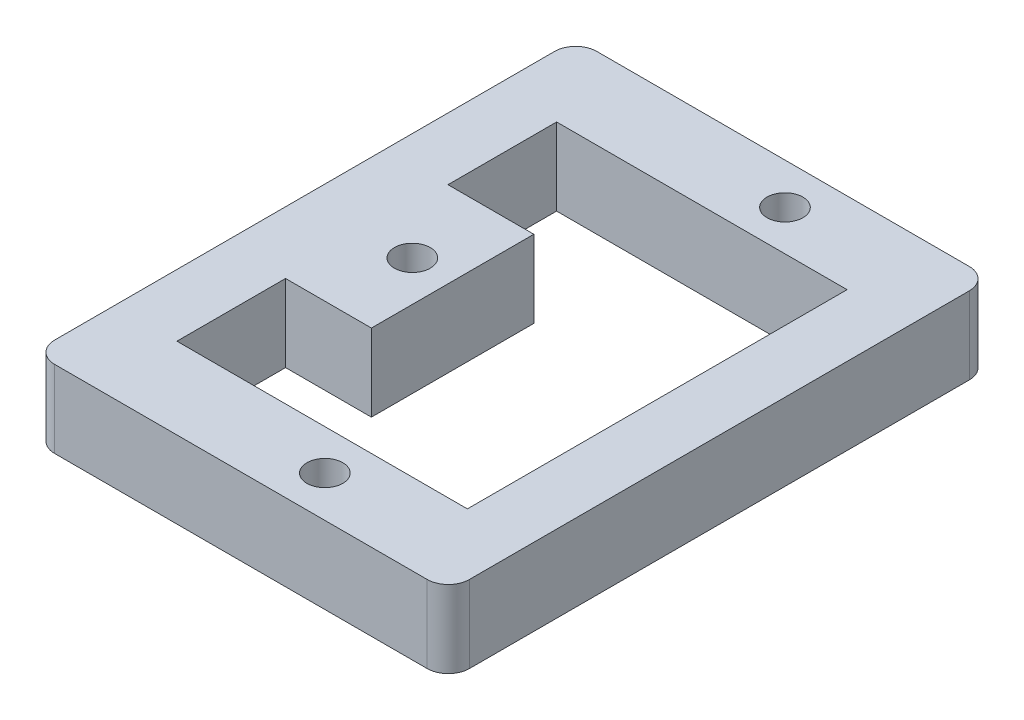
ISO-10303-21;
HEADER;
FILE_DESCRIPTION(('STEP AP214'),'2;1');
FILE_NAME('part.step','',(''),(''),'','','');
FILE_SCHEMA(('AUTOMOTIVE_DESIGN { 1 0 10303 214 1 1 1 1 }'));
ENDSEC;
DATA;
#1=APPLICATION_CONTEXT('core data for automotive mechanical design processes');
#2=APPLICATION_PROTOCOL_DEFINITION('international standard','automotive_design',2000,#1);
#3=PRODUCT_CONTEXT('',#1,'mechanical');
#4=PRODUCT('Part','Part','',(#3));
#5=PRODUCT_RELATED_PRODUCT_CATEGORY('part','',(#4));
#6=PRODUCT_DEFINITION_FORMATION('','',#4);
#7=PRODUCT_DEFINITION_CONTEXT('part definition',#1,'design');
#8=PRODUCT_DEFINITION('design','',#6,#7);
#9=PRODUCT_DEFINITION_SHAPE('','',#8);
#10=(LENGTH_UNIT() NAMED_UNIT(*) SI_UNIT(.MILLI.,.METRE.));
#11=(NAMED_UNIT(*) PLANE_ANGLE_UNIT() SI_UNIT($,.RADIAN.));
#12=(NAMED_UNIT(*) SI_UNIT($,.STERADIAN.) SOLID_ANGLE_UNIT());
#13=UNCERTAINTY_MEASURE_WITH_UNIT(LENGTH_MEASURE(1.E-05),#10,'distance_accuracy_value','');
#14=(GEOMETRIC_REPRESENTATION_CONTEXT(3) GLOBAL_UNCERTAINTY_ASSIGNED_CONTEXT((#13)) GLOBAL_UNIT_ASSIGNED_CONTEXT((#10,
#11,#12)) REPRESENTATION_CONTEXT('',''));
#15=CARTESIAN_POINT('',(0.,0.,0.));
#16=DIRECTION('',(0.,0.,1.));
#17=DIRECTION('',(1.,0.,0.));
#18=AXIS2_PLACEMENT_3D('',#15,#16,#17);
#19=CARTESIAN_POINT('',(-12.4841,4.6482,16.3195));
#20=DIRECTION('',(-1.,0.,0.));
#21=DIRECTION('',(0.,0.,1.));
#22=AXIS2_PLACEMENT_3D('',#19,#20,#21);
#23=PLANE('',#22);
#24=DIRECTION('',(0.,0.,-1.));
#25=VECTOR('',#24,1.);
#26=CARTESIAN_POINT('',(-12.4841,0.,16.3195));
#27=LINE('',#26,#25);
#28=CARTESIAN_POINT('',(-12.4841,0.,15.0495));
#29=VERTEX_POINT('',#28);
#30=CARTESIAN_POINT('',(-12.4841,0.,-15.0495));
#31=VERTEX_POINT('',#30);
#32=EDGE_CURVE('E200',#29,#31,#27,.T.);
#33=ORIENTED_EDGE('',*,*,#32,.F.);
#34=DIRECTION('',(0.,-1.,0.));
#35=VECTOR('',#34,1.);
#36=CARTESIAN_POINT('',(-12.4841,4.6482,15.0495));
#37=LINE('',#36,#35);
#38=CARTESIAN_POINT('',(-12.4841,4.6482,15.0495));
#39=VERTEX_POINT('',#38);
#40=EDGE_CURVE('E342',#29,#39,#37,.F.);
#41=ORIENTED_EDGE('',*,*,#40,.T.);
#42=DIRECTION('',(0.,0.,-1.));
#43=VECTOR('',#42,1.);
#44=CARTESIAN_POINT('',(-12.4841,4.6482,16.3195));
#45=LINE('',#44,#43);
#46=CARTESIAN_POINT('',(-12.4841,4.6482,-15.0495));
#47=VERTEX_POINT('',#46);
#48=EDGE_CURVE('E290',#39,#47,#45,.T.);
#49=ORIENTED_EDGE('',*,*,#48,.T.);
#50=DIRECTION('',(0.,-1.,0.));
#51=VECTOR('',#50,1.);
#52=CARTESIAN_POINT('',(-12.4841,4.6482,-15.0495));
#53=LINE('',#52,#51);
#54=EDGE_CURVE('E338',#47,#31,#53,.T.);
#55=ORIENTED_EDGE('',*,*,#54,.T.);
#56=EDGE_LOOP('',(#33,#41,#49,#55));
#57=FACE_BOUND('',#56,.T.);
#58=ADVANCED_FACE('F74',(#57),#23,.T.);
#59=CARTESIAN_POINT('',(-12.4841,4.6482,16.3195));
#60=DIRECTION('',(0.,0.,-1.));
#61=DIRECTION('',(-1.,0.,0.));
#62=AXIS2_PLACEMENT_3D('',#59,#60,#61);
#63=PLANE('',#62);
#64=DIRECTION('',(1.,0.,0.));
#65=VECTOR('',#64,1.);
#66=CARTESIAN_POINT('',(-12.4841,4.6482,16.3195));
#67=LINE('',#66,#65);
#68=CARTESIAN_POINT('',(-11.2141,4.6482,16.3195));
#69=VERTEX_POINT('',#68);
#70=CARTESIAN_POINT('',(11.2141,4.6482,16.3195));
#71=VERTEX_POINT('',#70);
#72=EDGE_CURVE('E301',#69,#71,#67,.T.);
#73=ORIENTED_EDGE('',*,*,#72,.F.);
#74=DIRECTION('',(0.,-1.,0.));
#75=VECTOR('',#74,1.);
#76=CARTESIAN_POINT('',(-11.2141,0.,16.3195));
#77=LINE('',#76,#75);
#78=CARTESIAN_POINT('',(-11.2141,0.,16.3195));
#79=VERTEX_POINT('',#78);
#80=EDGE_CURVE('E322',#69,#79,#77,.T.);
#81=ORIENTED_EDGE('',*,*,#80,.T.);
#82=DIRECTION('',(1.,0.,0.));
#83=VECTOR('',#82,1.);
#84=CARTESIAN_POINT('',(-12.4841,0.,16.3195));
#85=LINE('',#84,#83);
#86=CARTESIAN_POINT('',(11.2141,0.,16.3195));
#87=VERTEX_POINT('',#86);
#88=EDGE_CURVE('E295',#79,#87,#85,.T.);
#89=ORIENTED_EDGE('',*,*,#88,.T.);
#90=DIRECTION('',(0.,-1.,0.));
#91=VECTOR('',#90,1.);
#92=CARTESIAN_POINT('',(11.2141,4.6482,16.3195));
#93=LINE('',#92,#91);
#94=EDGE_CURVE('E305',#87,#71,#93,.F.);
#95=ORIENTED_EDGE('',*,*,#94,.T.);
#96=EDGE_LOOP('',(#73,#81,#89,#95));
#97=FACE_BOUND('',#96,.T.);
#98=ADVANCED_FACE('F391',(#97),#63,.F.);
#99=CARTESIAN_POINT('',(12.4841,4.6482,16.3195));
#100=DIRECTION('',(-1.,0.,0.));
#101=DIRECTION('',(0.,0.,1.));
#102=AXIS2_PLACEMENT_3D('',#99,#100,#101);
#103=PLANE('',#102);
#104=DIRECTION('',(0.,0.,-1.));
#105=VECTOR('',#104,1.);
#106=CARTESIAN_POINT('',(12.4841,4.6482,16.3195));
#107=LINE('',#106,#105);
#108=CARTESIAN_POINT('',(12.4841,4.6482,15.0495));
#109=VERTEX_POINT('',#108);
#110=CARTESIAN_POINT('',(12.4841,4.6482,-15.0495));
#111=VERTEX_POINT('',#110);
#112=EDGE_CURVE('E298',#109,#111,#107,.T.);
#113=ORIENTED_EDGE('',*,*,#112,.F.);
#114=DIRECTION('',(0.,-1.,0.));
#115=VECTOR('',#114,1.);
#116=CARTESIAN_POINT('',(12.4841,4.6482,15.0495));
#117=LINE('',#116,#115);
#118=CARTESIAN_POINT('',(12.4841,0.,15.0495));
#119=VERTEX_POINT('',#118);
#120=EDGE_CURVE('E359',#109,#119,#117,.T.);
#121=ORIENTED_EDGE('',*,*,#120,.T.);
#122=DIRECTION('',(0.,0.,-1.));
#123=VECTOR('',#122,1.);
#124=CARTESIAN_POINT('',(12.4841,0.,16.3195));
#125=LINE('',#124,#123);
#126=CARTESIAN_POINT('',(12.4841,0.,-15.0495));
#127=VERTEX_POINT('',#126);
#128=EDGE_CURVE('E313',#119,#127,#125,.T.);
#129=ORIENTED_EDGE('',*,*,#128,.T.);
#130=DIRECTION('',(0.,-1.,0.));
#131=VECTOR('',#130,1.);
#132=CARTESIAN_POINT('',(12.4841,4.6482,-15.0495));
#133=LINE('',#132,#131);
#134=EDGE_CURVE('E356',#127,#111,#133,.F.);
#135=ORIENTED_EDGE('',*,*,#134,.T.);
#136=EDGE_LOOP('',(#113,#121,#129,#135));
#137=FACE_BOUND('',#136,.T.);
#138=ADVANCED_FACE('F367',(#137),#103,.F.);
#139=CARTESIAN_POINT('',(-12.4841,4.6482,-16.3195));
#140=DIRECTION('',(0.,0.,-1.));
#141=DIRECTION('',(-1.,0.,0.));
#142=AXIS2_PLACEMENT_3D('',#139,#140,#141);
#143=PLANE('',#142);
#144=DIRECTION('',(1.,0.,0.));
#145=VECTOR('',#144,1.);
#146=CARTESIAN_POINT('',(-12.4841,4.6482,-16.3195));
#147=LINE('',#146,#145);
#148=CARTESIAN_POINT('',(-11.2141,4.6482,-16.3195));
#149=VERTEX_POINT('',#148);
#150=CARTESIAN_POINT('',(11.2141,4.6482,-16.3195));
#151=VERTEX_POINT('',#150);
#152=EDGE_CURVE('E294',#149,#151,#147,.T.);
#153=ORIENTED_EDGE('',*,*,#152,.T.);
#154=DIRECTION('',(0.,-1.,0.));
#155=VECTOR('',#154,1.);
#156=CARTESIAN_POINT('',(11.2141,0.,-16.3195));
#157=LINE('',#156,#155);
#158=CARTESIAN_POINT('',(11.2141,0.,-16.3195));
#159=VERTEX_POINT('',#158);
#160=EDGE_CURVE('E12',#151,#159,#157,.T.);
#161=ORIENTED_EDGE('',*,*,#160,.T.);
#162=DIRECTION('',(1.,0.,0.));
#163=VECTOR('',#162,1.);
#164=CARTESIAN_POINT('',(-12.4841,0.,-16.3195));
#165=LINE('',#164,#163);
#166=CARTESIAN_POINT('',(-11.2141,0.,-16.3195));
#167=VERTEX_POINT('',#166);
#168=EDGE_CURVE('E309',#167,#159,#165,.T.);
#169=ORIENTED_EDGE('',*,*,#168,.F.);
#170=DIRECTION('',(0.,-1.,0.));
#171=VECTOR('',#170,1.);
#172=CARTESIAN_POINT('',(-11.2141,4.6482,-16.3195));
#173=LINE('',#172,#171);
#174=EDGE_CURVE('E83',#167,#149,#173,.F.);
#175=ORIENTED_EDGE('',*,*,#174,.T.);
#176=EDGE_LOOP('',(#153,#161,#169,#175));
#177=FACE_BOUND('',#176,.T.);
#178=ADVANCED_FACE('F377',(#177),#143,.T.);
#179=CARTESIAN_POINT('',(0.,4.6482,0.));
#180=DIRECTION('',(0.,-1.,0.));
#181=DIRECTION('',(0.,0.,-1.));
#182=AXIS2_PLACEMENT_3D('',#179,#180,#181);
#183=PLANE('',#182);
#184=CARTESIAN_POINT('',(2.58422762645913,4.6482,-13.85062));
#185=DIRECTION('',(0.,1.,0.));
#186=DIRECTION('',(0.,0.,1.));
#187=AXIS2_PLACEMENT_3D('',#184,#185,#186);
#188=CIRCLE('',#187,1.0795);
#189=CARTESIAN_POINT('',(2.58422762645913,4.6482,-12.77112));
#190=VERTEX_POINT('',#189);
#191=EDGE_CURVE('E464',#190,#190,#188,.T.);
#192=ORIENTED_EDGE('',*,*,#191,.F.);
#193=EDGE_LOOP('',(#192));
#194=FACE_BOUND('',#193,.T.);
#195=CARTESIAN_POINT('',(2.58422762645912,4.6482,13.85062));
#196=DIRECTION('',(0.,1.,0.));
#197=DIRECTION('',(0.,0.,1.));
#198=AXIS2_PLACEMENT_3D('',#195,#196,#197);
#199=CIRCLE('',#198,1.0795);
#200=CARTESIAN_POINT('',(2.58422762645912,4.6482,14.93012));
#201=VERTEX_POINT('',#200);
#202=EDGE_CURVE('E472',#201,#201,#199,.T.);
#203=ORIENTED_EDGE('',*,*,#202,.F.);
#204=EDGE_LOOP('',(#203));
#205=FACE_BOUND('',#204,.T.);
#206=CARTESIAN_POINT('',(-6.00097237354087,4.6482,0.));
#207=DIRECTION('',(0.,1.,0.));
#208=DIRECTION('',(0.,0.,1.));
#209=AXIS2_PLACEMENT_3D('',#206,#207,#208);
#210=CIRCLE('',#209,1.0795);
#211=CARTESIAN_POINT('',(-6.00097237354087,4.6482,1.0795));
#212=VERTEX_POINT('',#211);
#213=EDGE_CURVE('E481',#212,#212,#210,.T.);
#214=ORIENTED_EDGE('',*,*,#213,.F.);
#215=EDGE_LOOP('',(#214));
#216=FACE_BOUND('',#215,.T.);
#217=DIRECTION('',(0.,0.,-1.));
#218=VECTOR('',#217,1.);
#219=CARTESIAN_POINT('',(-8.74372762645914,4.6482,0.));
#220=LINE('',#219,#218);
#221=CARTESIAN_POINT('',(-8.74372762645914,4.6482,-4.8895));
#222=VERTEX_POINT('',#221);
#223=CARTESIAN_POINT('',(-8.74372762645914,4.6482,-11.43));
#224=VERTEX_POINT('',#223);
#225=EDGE_CURVE('E193',#222,#224,#220,.T.);
#226=ORIENTED_EDGE('',*,*,#225,.T.);
#227=DIRECTION('',(1.,0.,0.));
#228=VECTOR('',#227,1.);
#229=CARTESIAN_POINT('',(0.,4.6482,-11.43));
#230=LINE('',#229,#228);
#231=CARTESIAN_POINT('',(8.74372762645913,4.6482,-11.43));
#232=VERTEX_POINT('',#231);
#233=EDGE_CURVE('E204',#224,#232,#230,.T.);
#234=ORIENTED_EDGE('',*,*,#233,.T.);
#235=DIRECTION('',(0.,0.,1.));
#236=VECTOR('',#235,1.);
#237=CARTESIAN_POINT('',(8.74372762645913,4.6482,0.));
#238=LINE('',#237,#236);
#239=CARTESIAN_POINT('',(8.74372762645913,4.6482,11.43));
#240=VERTEX_POINT('',#239);
#241=EDGE_CURVE('E239',#232,#240,#238,.T.);
#242=ORIENTED_EDGE('',*,*,#241,.T.);
#243=DIRECTION('',(-1.,0.,0.));
#244=VECTOR('',#243,1.);
#245=CARTESIAN_POINT('',(0.,4.6482,11.43));
#246=LINE('',#245,#244);
#247=CARTESIAN_POINT('',(-8.74372762645914,4.6482,11.43));
#248=VERTEX_POINT('',#247);
#249=EDGE_CURVE('E235',#240,#248,#246,.T.);
#250=ORIENTED_EDGE('',*,*,#249,.T.);
#251=DIRECTION('',(0.,0.,-1.));
#252=VECTOR('',#251,1.);
#253=CARTESIAN_POINT('',(-8.74372762645914,4.6482,0.));
#254=LINE('',#253,#252);
#255=CARTESIAN_POINT('',(-8.74372762645914,4.6482,4.8895));
#256=VERTEX_POINT('',#255);
#257=EDGE_CURVE('E231',#248,#256,#254,.T.);
#258=ORIENTED_EDGE('',*,*,#257,.T.);
#259=DIRECTION('',(1.,0.,0.));
#260=VECTOR('',#259,1.);
#261=CARTESIAN_POINT('',(0.,4.6482,4.8895));
#262=LINE('',#261,#260);
#263=CARTESIAN_POINT('',(-3.57527237354087,4.6482,4.8895));
#264=VERTEX_POINT('',#263);
#265=EDGE_CURVE('E227',#256,#264,#262,.T.);
#266=ORIENTED_EDGE('',*,*,#265,.T.);
#267=DIRECTION('',(0.,0.,-1.));
#268=VECTOR('',#267,1.);
#269=CARTESIAN_POINT('',(-3.57527237354087,4.6482,0.));
#270=LINE('',#269,#268);
#271=CARTESIAN_POINT('',(-3.57527237354087,4.6482,-4.8895));
#272=VERTEX_POINT('',#271);
#273=EDGE_CURVE('E221',#264,#272,#270,.T.);
#274=ORIENTED_EDGE('',*,*,#273,.T.);
#275=DIRECTION('',(-1.,0.,0.));
#276=VECTOR('',#275,1.);
#277=CARTESIAN_POINT('',(0.,4.6482,-4.8895));
#278=LINE('',#277,#276);
#279=EDGE_CURVE('E217',#272,#222,#278,.T.);
#280=ORIENTED_EDGE('',*,*,#279,.T.);
#281=EDGE_LOOP('',(#226,#234,#242,#250,#258,#266,#274,#280));
#282=FACE_BOUND('',#281,.T.);
#283=ORIENTED_EDGE('',*,*,#48,.F.);
#284=CARTESIAN_POINT('',(-11.2141,4.6482,15.0495));
#285=DIRECTION('',(0.,-1.,0.));
#286=DIRECTION('',(0.,0.,-1.));
#287=AXIS2_PLACEMENT_3D('',#284,#285,#286);
#288=CIRCLE('',#287,1.27);
#289=EDGE_CURVE('E353',#39,#69,#288,.F.);
#290=ORIENTED_EDGE('',*,*,#289,.T.);
#291=ORIENTED_EDGE('',*,*,#72,.T.);
#292=CARTESIAN_POINT('',(11.2141,4.6482,15.0495));
#293=DIRECTION('',(0.,-1.,0.));
#294=DIRECTION('',(0.,0.,-1.));
#295=AXIS2_PLACEMENT_3D('',#292,#293,#294);
#296=CIRCLE('',#295,1.27);
#297=EDGE_CURVE('E350',#71,#109,#296,.F.);
#298=ORIENTED_EDGE('',*,*,#297,.T.);
#299=ORIENTED_EDGE('',*,*,#112,.T.);
#300=CARTESIAN_POINT('',(11.2141,4.6482,-15.0495));
#301=DIRECTION('',(0.,-1.,0.));
#302=DIRECTION('',(0.,0.,-1.));
#303=AXIS2_PLACEMENT_3D('',#300,#301,#302);
#304=CIRCLE('',#303,1.27);
#305=EDGE_CURVE('E90',#111,#151,#304,.F.);
#306=ORIENTED_EDGE('',*,*,#305,.T.);
#307=ORIENTED_EDGE('',*,*,#152,.F.);
#308=CARTESIAN_POINT('',(-11.2141,4.6482,-15.0495));
#309=DIRECTION('',(0.,-1.,0.));
#310=DIRECTION('',(0.,0.,-1.));
#311=AXIS2_PLACEMENT_3D('',#308,#309,#310);
#312=CIRCLE('',#311,1.27);
#313=EDGE_CURVE('E345',#149,#47,#312,.F.);
#314=ORIENTED_EDGE('',*,*,#313,.T.);
#315=EDGE_LOOP('',(#283,#290,#291,#298,#299,#306,#307,#314));
#316=FACE_BOUND('',#315,.T.);
#317=ADVANCED_FACE('F214',(#194,#205,#216,#282,#316),#183,.F.);
#318=CARTESIAN_POINT('',(0.,0.,0.));
#319=DIRECTION('',(0.,-1.,0.));
#320=DIRECTION('',(0.,0.,-1.));
#321=AXIS2_PLACEMENT_3D('',#318,#319,#320);
#322=PLANE('',#321);
#323=CARTESIAN_POINT('',(2.58422762645913,0.,-13.85062));
#324=DIRECTION('',(0.,1.,0.));
#325=DIRECTION('',(0.,0.,1.));
#326=AXIS2_PLACEMENT_3D('',#323,#324,#325);
#327=CIRCLE('',#326,1.0795);
#328=CARTESIAN_POINT('',(2.58422762645913,0.,-12.77112));
#329=VERTEX_POINT('',#328);
#330=EDGE_CURVE('E245',#329,#329,#327,.T.);
#331=ORIENTED_EDGE('',*,*,#330,.T.);
#332=EDGE_LOOP('',(#331));
#333=FACE_BOUND('',#332,.T.);
#334=CARTESIAN_POINT('',(2.58422762645912,0.,13.85062));
#335=DIRECTION('',(0.,1.,0.));
#336=DIRECTION('',(0.,0.,1.));
#337=AXIS2_PLACEMENT_3D('',#334,#335,#336);
#338=CIRCLE('',#337,1.0795);
#339=CARTESIAN_POINT('',(2.58422762645912,0.,14.93012));
#340=VERTEX_POINT('',#339);
#341=EDGE_CURVE('E466',#340,#340,#338,.T.);
#342=ORIENTED_EDGE('',*,*,#341,.T.);
#343=EDGE_LOOP('',(#342));
#344=FACE_BOUND('',#343,.T.);
#345=CARTESIAN_POINT('',(-6.00097237354087,0.,0.));
#346=DIRECTION('',(0.,1.,0.));
#347=DIRECTION('',(0.,0.,1.));
#348=AXIS2_PLACEMENT_3D('',#345,#346,#347);
#349=CIRCLE('',#348,1.0795);
#350=CARTESIAN_POINT('',(-6.00097237354087,0.,1.0795));
#351=VERTEX_POINT('',#350);
#352=EDGE_CURVE('E478',#351,#351,#349,.T.);
#353=ORIENTED_EDGE('',*,*,#352,.T.);
#354=EDGE_LOOP('',(#353));
#355=FACE_BOUND('',#354,.T.);
#356=DIRECTION('',(1.,0.,0.));
#357=VECTOR('',#356,1.);
#358=CARTESIAN_POINT('',(0.,0.,-11.43));
#359=LINE('',#358,#357);
#360=CARTESIAN_POINT('',(-8.74372762645914,0.,-11.43));
#361=VERTEX_POINT('',#360);
#362=CARTESIAN_POINT('',(8.74372762645913,0.,-11.43));
#363=VERTEX_POINT('',#362);
#364=EDGE_CURVE('E242',#361,#363,#359,.T.);
#365=ORIENTED_EDGE('',*,*,#364,.F.);
#366=DIRECTION('',(0.,0.,-1.));
#367=VECTOR('',#366,1.);
#368=CARTESIAN_POINT('',(-8.74372762645914,0.,0.));
#369=LINE('',#368,#367);
#370=CARTESIAN_POINT('',(-8.74372762645914,0.,-4.8895));
#371=VERTEX_POINT('',#370);
#372=EDGE_CURVE('E196',#371,#361,#369,.T.);
#373=ORIENTED_EDGE('',*,*,#372,.F.);
#374=DIRECTION('',(-1.,0.,0.));
#375=VECTOR('',#374,1.);
#376=CARTESIAN_POINT('',(0.,0.,-4.8895));
#377=LINE('',#376,#375);
#378=CARTESIAN_POINT('',(-3.57527237354087,0.,-4.8895));
#379=VERTEX_POINT('',#378);
#380=EDGE_CURVE('E248',#379,#371,#377,.T.);
#381=ORIENTED_EDGE('',*,*,#380,.F.);
#382=DIRECTION('',(0.,0.,-1.));
#383=VECTOR('',#382,1.);
#384=CARTESIAN_POINT('',(-3.57527237354087,0.,0.));
#385=LINE('',#384,#383);
#386=CARTESIAN_POINT('',(-3.57527237354087,0.,4.8895));
#387=VERTEX_POINT('',#386);
#388=EDGE_CURVE('E252',#387,#379,#385,.T.);
#389=ORIENTED_EDGE('',*,*,#388,.F.);
#390=DIRECTION('',(1.,0.,0.));
#391=VECTOR('',#390,1.);
#392=CARTESIAN_POINT('',(0.,0.,4.8895));
#393=LINE('',#392,#391);
#394=CARTESIAN_POINT('',(-8.74372762645914,0.,4.8895));
#395=VERTEX_POINT('',#394);
#396=EDGE_CURVE('E256',#395,#387,#393,.T.);
#397=ORIENTED_EDGE('',*,*,#396,.F.);
#398=DIRECTION('',(0.,0.,-1.));
#399=VECTOR('',#398,1.);
#400=CARTESIAN_POINT('',(-8.74372762645914,0.,0.));
#401=LINE('',#400,#399);
#402=CARTESIAN_POINT('',(-8.74372762645914,0.,11.43));
#403=VERTEX_POINT('',#402);
#404=EDGE_CURVE('E260',#403,#395,#401,.T.);
#405=ORIENTED_EDGE('',*,*,#404,.F.);
#406=DIRECTION('',(-1.,0.,0.));
#407=VECTOR('',#406,1.);
#408=CARTESIAN_POINT('',(0.,0.,11.43));
#409=LINE('',#408,#407);
#410=CARTESIAN_POINT('',(8.74372762645913,0.,11.43));
#411=VERTEX_POINT('',#410);
#412=EDGE_CURVE('E264',#411,#403,#409,.T.);
#413=ORIENTED_EDGE('',*,*,#412,.F.);
#414=DIRECTION('',(0.,0.,1.));
#415=VECTOR('',#414,1.);
#416=CARTESIAN_POINT('',(8.74372762645913,0.,0.));
#417=LINE('',#416,#415);
#418=EDGE_CURVE('E212',#363,#411,#417,.T.);
#419=ORIENTED_EDGE('',*,*,#418,.F.);
#420=EDGE_LOOP('',(#365,#373,#381,#389,#397,#405,#413,#419));
#421=FACE_BOUND('',#420,.T.);
#422=ORIENTED_EDGE('',*,*,#88,.F.);
#423=CARTESIAN_POINT('',(-11.2141,0.,15.0495));
#424=DIRECTION('',(0.,-1.,0.));
#425=DIRECTION('',(0.,0.,-1.));
#426=AXIS2_PLACEMENT_3D('',#423,#424,#425);
#427=CIRCLE('',#426,1.27);
#428=EDGE_CURVE('E335',#79,#29,#427,.T.);
#429=ORIENTED_EDGE('',*,*,#428,.T.);
#430=ORIENTED_EDGE('',*,*,#32,.T.);
#431=CARTESIAN_POINT('',(-11.2141,0.,-15.0495));
#432=DIRECTION('',(0.,-1.,0.));
#433=DIRECTION('',(0.,0.,-1.));
#434=AXIS2_PLACEMENT_3D('',#431,#432,#433);
#435=CIRCLE('',#434,1.27);
#436=EDGE_CURVE('E326',#31,#167,#435,.T.);
#437=ORIENTED_EDGE('',*,*,#436,.T.);
#438=ORIENTED_EDGE('',*,*,#168,.T.);
#439=CARTESIAN_POINT('',(11.2141,0.,-15.0495));
#440=DIRECTION('',(0.,-1.,0.));
#441=DIRECTION('',(0.,0.,-1.));
#442=AXIS2_PLACEMENT_3D('',#439,#440,#441);
#443=CIRCLE('',#442,1.27);
#444=EDGE_CURVE('E329',#159,#127,#443,.T.);
#445=ORIENTED_EDGE('',*,*,#444,.T.);
#446=ORIENTED_EDGE('',*,*,#128,.F.);
#447=CARTESIAN_POINT('',(11.2141,0.,15.0495));
#448=DIRECTION('',(0.,-1.,0.));
#449=DIRECTION('',(0.,0.,-1.));
#450=AXIS2_PLACEMENT_3D('',#447,#448,#449);
#451=CIRCLE('',#450,1.27);
#452=EDGE_CURVE('E332',#119,#87,#451,.T.);
#453=ORIENTED_EDGE('',*,*,#452,.T.);
#454=EDGE_LOOP('',(#422,#429,#430,#437,#438,#445,#446,#453));
#455=FACE_BOUND('',#454,.T.);
#456=ADVANCED_FACE('F373',(#333,#344,#355,#421,#455),#322,.T.);
#457=CARTESIAN_POINT('',(0.,4.6482,-11.43));
#458=DIRECTION('',(0.,0.,-1.));
#459=DIRECTION('',(-1.,0.,0.));
#460=AXIS2_PLACEMENT_3D('',#457,#458,#459);
#461=PLANE('',#460);
#462=ORIENTED_EDGE('',*,*,#364,.T.);
#463=DIRECTION('',(0.,-1.,0.));
#464=VECTOR('',#463,1.);
#465=CARTESIAN_POINT('',(8.74372762645913,4.6482,-11.43));
#466=LINE('',#465,#464);
#467=EDGE_CURVE('E207',#232,#363,#466,.T.);
#468=ORIENTED_EDGE('',*,*,#467,.F.);
#469=ORIENTED_EDGE('',*,*,#233,.F.);
#470=DIRECTION('',(0.,-1.,0.));
#471=VECTOR('',#470,1.);
#472=CARTESIAN_POINT('',(-8.74372762645914,4.6482,-11.43));
#473=LINE('',#472,#471);
#474=EDGE_CURVE('E189',#224,#361,#473,.T.);
#475=ORIENTED_EDGE('',*,*,#474,.T.);
#476=EDGE_LOOP('',(#462,#468,#469,#475));
#477=FACE_BOUND('',#476,.T.);
#478=ADVANCED_FACE('F205',(#477),#461,.F.);
#479=CARTESIAN_POINT('',(-8.74372762645914,4.6482,0.));
#480=DIRECTION('',(-1.,0.,0.));
#481=DIRECTION('',(0.,0.,1.));
#482=AXIS2_PLACEMENT_3D('',#479,#480,#481);
#483=PLANE('',#482);
#484=ORIENTED_EDGE('',*,*,#372,.T.);
#485=ORIENTED_EDGE('',*,*,#474,.F.);
#486=ORIENTED_EDGE('',*,*,#225,.F.);
#487=DIRECTION('',(0.,-1.,0.));
#488=VECTOR('',#487,1.);
#489=CARTESIAN_POINT('',(-8.74372762645914,4.6482,-4.8895));
#490=LINE('',#489,#488);
#491=EDGE_CURVE('E201',#222,#371,#490,.T.);
#492=ORIENTED_EDGE('',*,*,#491,.T.);
#493=EDGE_LOOP('',(#484,#485,#486,#492));
#494=FACE_BOUND('',#493,.T.);
#495=ADVANCED_FACE('F191',(#494),#483,.F.);
#496=CARTESIAN_POINT('',(0.,4.6482,-4.8895));
#497=DIRECTION('',(0.,0.,1.));
#498=DIRECTION('',(1.,0.,0.));
#499=AXIS2_PLACEMENT_3D('',#496,#497,#498);
#500=PLANE('',#499);
#501=ORIENTED_EDGE('',*,*,#380,.T.);
#502=ORIENTED_EDGE('',*,*,#491,.F.);
#503=ORIENTED_EDGE('',*,*,#279,.F.);
#504=DIRECTION('',(0.,-1.,0.));
#505=VECTOR('',#504,1.);
#506=CARTESIAN_POINT('',(-3.57527237354087,4.6482,-4.8895));
#507=LINE('',#506,#505);
#508=EDGE_CURVE('E285',#272,#379,#507,.T.);
#509=ORIENTED_EDGE('',*,*,#508,.T.);
#510=EDGE_LOOP('',(#501,#502,#503,#509));
#511=FACE_BOUND('',#510,.T.);
#512=ADVANCED_FACE('F423',(#511),#500,.F.);
#513=CARTESIAN_POINT('',(-3.57527237354087,4.6482,0.));
#514=DIRECTION('',(-1.,0.,0.));
#515=DIRECTION('',(0.,0.,1.));
#516=AXIS2_PLACEMENT_3D('',#513,#514,#515);
#517=PLANE('',#516);
#518=ORIENTED_EDGE('',*,*,#388,.T.);
#519=ORIENTED_EDGE('',*,*,#508,.F.);
#520=ORIENTED_EDGE('',*,*,#273,.F.);
#521=DIRECTION('',(0.,-1.,0.));
#522=VECTOR('',#521,1.);
#523=CARTESIAN_POINT('',(-3.57527237354087,4.6482,4.8895));
#524=LINE('',#523,#522);
#525=EDGE_CURVE('E282',#264,#387,#524,.T.);
#526=ORIENTED_EDGE('',*,*,#525,.T.);
#527=EDGE_LOOP('',(#518,#519,#520,#526));
#528=FACE_BOUND('',#527,.T.);
#529=ADVANCED_FACE('F426',(#528),#517,.F.);
#530=CARTESIAN_POINT('',(0.,4.6482,4.8895));
#531=DIRECTION('',(0.,0.,-1.));
#532=DIRECTION('',(-1.,0.,0.));
#533=AXIS2_PLACEMENT_3D('',#530,#531,#532);
#534=PLANE('',#533);
#535=ORIENTED_EDGE('',*,*,#396,.T.);
#536=ORIENTED_EDGE('',*,*,#525,.F.);
#537=ORIENTED_EDGE('',*,*,#265,.F.);
#538=DIRECTION('',(0.,-1.,0.));
#539=VECTOR('',#538,1.);
#540=CARTESIAN_POINT('',(-8.74372762645914,4.6482,4.8895));
#541=LINE('',#540,#539);
#542=EDGE_CURVE('E279',#256,#395,#541,.T.);
#543=ORIENTED_EDGE('',*,*,#542,.T.);
#544=EDGE_LOOP('',(#535,#536,#537,#543));
#545=FACE_BOUND('',#544,.T.);
#546=ADVANCED_FACE('F430',(#545),#534,.F.);
#547=CARTESIAN_POINT('',(-8.74372762645914,4.6482,0.));
#548=DIRECTION('',(-1.,0.,0.));
#549=DIRECTION('',(0.,0.,1.));
#550=AXIS2_PLACEMENT_3D('',#547,#548,#549);
#551=PLANE('',#550);
#552=ORIENTED_EDGE('',*,*,#404,.T.);
#553=ORIENTED_EDGE('',*,*,#542,.F.);
#554=ORIENTED_EDGE('',*,*,#257,.F.);
#555=DIRECTION('',(0.,-1.,0.));
#556=VECTOR('',#555,1.);
#557=CARTESIAN_POINT('',(-8.74372762645914,4.6482,11.43));
#558=LINE('',#557,#556);
#559=EDGE_CURVE('E276',#248,#403,#558,.T.);
#560=ORIENTED_EDGE('',*,*,#559,.T.);
#561=EDGE_LOOP('',(#552,#553,#554,#560));
#562=FACE_BOUND('',#561,.T.);
#563=ADVANCED_FACE('F434',(#562),#551,.F.);
#564=CARTESIAN_POINT('',(0.,4.6482,11.43));
#565=DIRECTION('',(0.,0.,1.));
#566=DIRECTION('',(1.,0.,0.));
#567=AXIS2_PLACEMENT_3D('',#564,#565,#566);
#568=PLANE('',#567);
#569=ORIENTED_EDGE('',*,*,#412,.T.);
#570=ORIENTED_EDGE('',*,*,#559,.F.);
#571=ORIENTED_EDGE('',*,*,#249,.F.);
#572=DIRECTION('',(0.,-1.,0.));
#573=VECTOR('',#572,1.);
#574=CARTESIAN_POINT('',(8.74372762645913,4.6482,11.43));
#575=LINE('',#574,#573);
#576=EDGE_CURVE('E273',#240,#411,#575,.T.);
#577=ORIENTED_EDGE('',*,*,#576,.T.);
#578=EDGE_LOOP('',(#569,#570,#571,#577));
#579=FACE_BOUND('',#578,.T.);
#580=ADVANCED_FACE('F438',(#579),#568,.F.);
#581=CARTESIAN_POINT('',(8.74372762645913,4.6482,0.));
#582=DIRECTION('',(1.,0.,0.));
#583=DIRECTION('',(0.,0.,-1.));
#584=AXIS2_PLACEMENT_3D('',#581,#582,#583);
#585=PLANE('',#584);
#586=ORIENTED_EDGE('',*,*,#418,.T.);
#587=ORIENTED_EDGE('',*,*,#576,.F.);
#588=ORIENTED_EDGE('',*,*,#241,.F.);
#589=ORIENTED_EDGE('',*,*,#467,.T.);
#590=EDGE_LOOP('',(#586,#587,#588,#589));
#591=FACE_BOUND('',#590,.T.);
#592=ADVANCED_FACE('F442',(#591),#585,.F.);
#593=CARTESIAN_POINT('',(-6.00097237354087,0.,0.));
#594=DIRECTION('',(0.,1.,0.));
#595=DIRECTION('',(0.,0.,1.));
#596=AXIS2_PLACEMENT_3D('',#593,#594,#595);
#597=CYLINDRICAL_SURFACE('',#596,1.0795);
#598=CARTESIAN_POINT('',(-6.00097237354087,0.,1.0795));
#599=CARTESIAN_POINT('',(-6.00097237354087,0.0484187499999999,1.0795));
#600=CARTESIAN_POINT('',(-6.00097237354087,0.0968375,1.0795));
#601=CARTESIAN_POINT('',(-6.00097237354087,0.193675,1.0795));
#602=CARTESIAN_POINT('',(-6.00097237354087,0.24209375,1.0795));
#603=CARTESIAN_POINT('',(-6.00097237354087,0.33893125,1.0795));
#604=CARTESIAN_POINT('',(-6.00097237354087,0.38735,1.0795));
#605=CARTESIAN_POINT('',(-6.00097237354087,0.4841875,1.0795));
#606=CARTESIAN_POINT('',(-6.00097237354087,0.53260625,1.0795));
#607=CARTESIAN_POINT('',(-6.00097237354087,0.62944375,1.0795));
#608=CARTESIAN_POINT('',(-6.00097237354087,0.6778625,1.0795));
#609=CARTESIAN_POINT('',(-6.00097237354087,0.7747,1.0795));
#610=CARTESIAN_POINT('',(-6.00097237354087,0.82311875,1.0795));
#611=CARTESIAN_POINT('',(-6.00097237354087,0.91995625,1.0795));
#612=CARTESIAN_POINT('',(-6.00097237354087,0.968375,1.0795));
#613=CARTESIAN_POINT('',(-6.00097237354087,1.0652125,1.0795));
#614=CARTESIAN_POINT('',(-6.00097237354087,1.11363125,1.0795));
#615=CARTESIAN_POINT('',(-6.00097237354087,1.21046875,1.0795));
#616=CARTESIAN_POINT('',(-6.00097237354087,1.2588875,1.0795));
#617=CARTESIAN_POINT('',(-6.00097237354087,1.355725,1.0795));
#618=CARTESIAN_POINT('',(-6.00097237354087,1.40414375,1.0795));
#619=CARTESIAN_POINT('',(-6.00097237354087,1.50098125,1.0795));
#620=CARTESIAN_POINT('',(-6.00097237354087,1.5494,1.0795));
#621=CARTESIAN_POINT('',(-6.00097237354087,1.6462375,1.0795));
#622=CARTESIAN_POINT('',(-6.00097237354087,1.69465625,1.0795));
#623=CARTESIAN_POINT('',(-6.00097237354087,1.79149375,1.0795));
#624=CARTESIAN_POINT('',(-6.00097237354087,1.8399125,1.0795));
#625=CARTESIAN_POINT('',(-6.00097237354087,1.93675,1.0795));
#626=CARTESIAN_POINT('',(-6.00097237354087,1.98516875,1.0795));
#627=CARTESIAN_POINT('',(-6.00097237354087,2.08200625,1.0795));
#628=CARTESIAN_POINT('',(-6.00097237354087,2.130425,1.0795));
#629=CARTESIAN_POINT('',(-6.00097237354087,2.2272625,1.0795));
#630=CARTESIAN_POINT('',(-6.00097237354087,2.27568125,1.0795));
#631=CARTESIAN_POINT('',(-6.00097237354087,2.37251875,1.0795));
#632=CARTESIAN_POINT('',(-6.00097237354087,2.4209375,1.0795));
#633=CARTESIAN_POINT('',(-6.00097237354087,2.517775,1.0795));
#634=CARTESIAN_POINT('',(-6.00097237354087,2.56619375,1.0795));
#635=CARTESIAN_POINT('',(-6.00097237354087,2.66303125,1.0795));
#636=CARTESIAN_POINT('',(-6.00097237354087,2.71145,1.0795));
#637=CARTESIAN_POINT('',(-6.00097237354087,2.8082875,1.0795));
#638=CARTESIAN_POINT('',(-6.00097237354087,2.85670625,1.0795));
#639=CARTESIAN_POINT('',(-6.00097237354087,2.95354375,1.0795));
#640=CARTESIAN_POINT('',(-6.00097237354087,3.0019625,1.0795));
#641=CARTESIAN_POINT('',(-6.00097237354087,3.0988,1.0795));
#642=CARTESIAN_POINT('',(-6.00097237354087,3.14721875,1.0795));
#643=CARTESIAN_POINT('',(-6.00097237354087,3.24405625,1.0795));
#644=CARTESIAN_POINT('',(-6.00097237354087,3.292475,1.0795));
#645=CARTESIAN_POINT('',(-6.00097237354087,3.3893125,1.0795));
#646=CARTESIAN_POINT('',(-6.00097237354087,3.43773125,1.0795));
#647=CARTESIAN_POINT('',(-6.00097237354087,3.53456875,1.0795));
#648=CARTESIAN_POINT('',(-6.00097237354087,3.5829875,1.0795));
#649=CARTESIAN_POINT('',(-6.00097237354087,3.679825,1.0795));
#650=CARTESIAN_POINT('',(-6.00097237354087,3.72824375,1.0795));
#651=CARTESIAN_POINT('',(-6.00097237354087,3.82508125,1.0795));
#652=CARTESIAN_POINT('',(-6.00097237354087,3.8735,1.0795));
#653=CARTESIAN_POINT('',(-6.00097237354087,3.9703375,1.0795));
#654=CARTESIAN_POINT('',(-6.00097237354087,4.01875625,1.0795));
#655=CARTESIAN_POINT('',(-6.00097237354087,4.11559375,1.0795));
#656=CARTESIAN_POINT('',(-6.00097237354087,4.1640125,1.0795));
#657=CARTESIAN_POINT('',(-6.00097237354087,4.26085,1.0795));
#658=CARTESIAN_POINT('',(-6.00097237354087,4.30926875,1.0795));
#659=CARTESIAN_POINT('',(-6.00097237354087,4.40610625,1.0795));
#660=CARTESIAN_POINT('',(-6.00097237354087,4.454525,1.0795));
#661=CARTESIAN_POINT('',(-6.00097237354087,4.5513625,1.0795));
#662=CARTESIAN_POINT('',(-6.00097237354087,4.59978125,1.0795));
#663=CARTESIAN_POINT('',(-6.00097237354087,4.6482,1.0795));
#664=B_SPLINE_CURVE_WITH_KNOTS('',3,(#598,#599,#600,#601,#602,#603,#604,#605,#606,#607,#608,
#609,#610,#611,#612,#613,#614,#615,#616,#617,#618,#619,#620,#621,#622,#623,#624,#625,#626,#627,
#628,#629,#630,#631,#632,#633,#634,#635,#636,#637,#638,#639,#640,#641,#642,#643,#644,#645,#646,
#647,#648,#649,#650,#651,#652,#653,#654,#655,#656,#657,#658,#659,#660,#661,#662,#663),
.UNSPECIFIED.,.F.,.F.,(4,2,2,2,2,2,2,2,2,2,2,2,2,2,2,2,2,2,2,2,2,2,2,2,2,2,2,2,2,2,2,2,4),(0.,
0.14525625,0.2905125,0.43576875,0.581025,0.72628125,0.8715375,1.01679375,1.16205,1.30730625,
1.4525625,1.59781875,1.743075,1.88833125,2.0335875,2.17884375,2.3241,2.46935625,2.6146125,
2.75986875,2.905125,3.05038125,3.1956375,3.34089375,3.48615,3.63140625,3.7766625,3.92191875,
4.067175,4.21243125,4.3576875,4.50294375,4.6482),.UNSPECIFIED.);
#665=EDGE_CURVE('BSEAM446',#351,#212,#664,.T.);
#666=ORIENTED_EDGE('',*,*,#352,.F.);
#667=ORIENTED_EDGE('',*,*,#213,.T.);
#668=ORIENTED_EDGE('',*,*,#665,.T.);
#669=ORIENTED_EDGE('',*,*,#665,.F.);
#670=EDGE_LOOP('',(#666,#668,#667,#669));
#671=FACE_BOUND('',#670,.T.);
#672=ADVANCED_FACE('F446',(#671),#597,.F.);
#673=CARTESIAN_POINT('',(2.58422762645912,0.,13.85062));
#674=DIRECTION('',(0.,1.,0.));
#675=DIRECTION('',(0.,0.,1.));
#676=AXIS2_PLACEMENT_3D('',#673,#674,#675);
#677=CYLINDRICAL_SURFACE('',#676,1.0795);
#678=CARTESIAN_POINT('',(2.58422762645912,0.,14.93012));
#679=CARTESIAN_POINT('',(2.58422762645912,0.0484187499999999,14.93012));
#680=CARTESIAN_POINT('',(2.58422762645912,0.0968375,14.93012));
#681=CARTESIAN_POINT('',(2.58422762645912,0.193675,14.93012));
#682=CARTESIAN_POINT('',(2.58422762645912,0.24209375,14.93012));
#683=CARTESIAN_POINT('',(2.58422762645912,0.33893125,14.93012));
#684=CARTESIAN_POINT('',(2.58422762645912,0.38735,14.93012));
#685=CARTESIAN_POINT('',(2.58422762645912,0.4841875,14.93012));
#686=CARTESIAN_POINT('',(2.58422762645912,0.53260625,14.93012));
#687=CARTESIAN_POINT('',(2.58422762645912,0.62944375,14.93012));
#688=CARTESIAN_POINT('',(2.58422762645912,0.6778625,14.93012));
#689=CARTESIAN_POINT('',(2.58422762645912,0.7747,14.93012));
#690=CARTESIAN_POINT('',(2.58422762645912,0.82311875,14.93012));
#691=CARTESIAN_POINT('',(2.58422762645912,0.91995625,14.93012));
#692=CARTESIAN_POINT('',(2.58422762645912,0.968375,14.93012));
#693=CARTESIAN_POINT('',(2.58422762645912,1.0652125,14.93012));
#694=CARTESIAN_POINT('',(2.58422762645912,1.11363125,14.93012));
#695=CARTESIAN_POINT('',(2.58422762645912,1.21046875,14.93012));
#696=CARTESIAN_POINT('',(2.58422762645912,1.2588875,14.93012));
#697=CARTESIAN_POINT('',(2.58422762645912,1.355725,14.93012));
#698=CARTESIAN_POINT('',(2.58422762645912,1.40414375,14.93012));
#699=CARTESIAN_POINT('',(2.58422762645912,1.50098125,14.93012));
#700=CARTESIAN_POINT('',(2.58422762645912,1.5494,14.93012));
#701=CARTESIAN_POINT('',(2.58422762645912,1.6462375,14.93012));
#702=CARTESIAN_POINT('',(2.58422762645912,1.69465625,14.93012));
#703=CARTESIAN_POINT('',(2.58422762645912,1.79149375,14.93012));
#704=CARTESIAN_POINT('',(2.58422762645912,1.8399125,14.93012));
#705=CARTESIAN_POINT('',(2.58422762645912,1.93675,14.93012));
#706=CARTESIAN_POINT('',(2.58422762645912,1.98516875,14.93012));
#707=CARTESIAN_POINT('',(2.58422762645912,2.08200625,14.93012));
#708=CARTESIAN_POINT('',(2.58422762645912,2.130425,14.93012));
#709=CARTESIAN_POINT('',(2.58422762645912,2.2272625,14.93012));
#710=CARTESIAN_POINT('',(2.58422762645912,2.27568125,14.93012));
#711=CARTESIAN_POINT('',(2.58422762645912,2.37251875,14.93012));
#712=CARTESIAN_POINT('',(2.58422762645912,2.4209375,14.93012));
#713=CARTESIAN_POINT('',(2.58422762645912,2.517775,14.93012));
#714=CARTESIAN_POINT('',(2.58422762645912,2.56619375,14.93012));
#715=CARTESIAN_POINT('',(2.58422762645912,2.66303125,14.93012));
#716=CARTESIAN_POINT('',(2.58422762645912,2.71145,14.93012));
#717=CARTESIAN_POINT('',(2.58422762645912,2.8082875,14.93012));
#718=CARTESIAN_POINT('',(2.58422762645912,2.85670625,14.93012));
#719=CARTESIAN_POINT('',(2.58422762645912,2.95354375,14.93012));
#720=CARTESIAN_POINT('',(2.58422762645912,3.0019625,14.93012));
#721=CARTESIAN_POINT('',(2.58422762645912,3.0988,14.93012));
#722=CARTESIAN_POINT('',(2.58422762645912,3.14721875,14.93012));
#723=CARTESIAN_POINT('',(2.58422762645912,3.24405625,14.93012));
#724=CARTESIAN_POINT('',(2.58422762645912,3.292475,14.93012));
#725=CARTESIAN_POINT('',(2.58422762645912,3.3893125,14.93012));
#726=CARTESIAN_POINT('',(2.58422762645912,3.43773125,14.93012));
#727=CARTESIAN_POINT('',(2.58422762645912,3.53456875,14.93012));
#728=CARTESIAN_POINT('',(2.58422762645912,3.5829875,14.93012));
#729=CARTESIAN_POINT('',(2.58422762645912,3.679825,14.93012));
#730=CARTESIAN_POINT('',(2.58422762645912,3.72824375,14.93012));
#731=CARTESIAN_POINT('',(2.58422762645912,3.82508125,14.93012));
#732=CARTESIAN_POINT('',(2.58422762645912,3.8735,14.93012));
#733=CARTESIAN_POINT('',(2.58422762645912,3.9703375,14.93012));
#734=CARTESIAN_POINT('',(2.58422762645912,4.01875625,14.93012));
#735=CARTESIAN_POINT('',(2.58422762645912,4.11559375,14.93012));
#736=CARTESIAN_POINT('',(2.58422762645912,4.1640125,14.93012));
#737=CARTESIAN_POINT('',(2.58422762645912,4.26085,14.93012));
#738=CARTESIAN_POINT('',(2.58422762645912,4.30926875,14.93012));
#739=CARTESIAN_POINT('',(2.58422762645912,4.40610625,14.93012));
#740=CARTESIAN_POINT('',(2.58422762645912,4.454525,14.93012));
#741=CARTESIAN_POINT('',(2.58422762645912,4.5513625,14.93012));
#742=CARTESIAN_POINT('',(2.58422762645912,4.59978125,14.93012));
#743=CARTESIAN_POINT('',(2.58422762645912,4.6482,14.93012));
#744=B_SPLINE_CURVE_WITH_KNOTS('',3,(#678,#679,#680,#681,#682,#683,#684,#685,#686,#687,#688,
#689,#690,#691,#692,#693,#694,#695,#696,#697,#698,#699,#700,#701,#702,#703,#704,#705,#706,#707,
#708,#709,#710,#711,#712,#713,#714,#715,#716,#717,#718,#719,#720,#721,#722,#723,#724,#725,#726,
#727,#728,#729,#730,#731,#732,#733,#734,#735,#736,#737,#738,#739,#740,#741,#742,#743),
.UNSPECIFIED.,.F.,.F.,(4,2,2,2,2,2,2,2,2,2,2,2,2,2,2,2,2,2,2,2,2,2,2,2,2,2,2,2,2,2,2,2,4),(0.,
0.14525625,0.2905125,0.43576875,0.581025,0.72628125,0.8715375,1.01679375,1.16205,1.30730625,
1.4525625,1.59781875,1.743075,1.88833125,2.0335875,2.17884375,2.3241,2.46935625,2.6146125,
2.75986875,2.905125,3.05038125,3.1956375,3.34089375,3.48615,3.63140625,3.7766625,3.92191875,
4.067175,4.21243125,4.3576875,4.50294375,4.6482),.UNSPECIFIED.);
#745=EDGE_CURVE('BSEAM450',#340,#201,#744,.T.);
#746=ORIENTED_EDGE('',*,*,#341,.F.);
#747=ORIENTED_EDGE('',*,*,#202,.T.);
#748=ORIENTED_EDGE('',*,*,#745,.T.);
#749=ORIENTED_EDGE('',*,*,#745,.F.);
#750=EDGE_LOOP('',(#746,#748,#747,#749));
#751=FACE_BOUND('',#750,.T.);
#752=ADVANCED_FACE('F450',(#751),#677,.F.);
#753=CARTESIAN_POINT('',(2.58422762645913,0.,-13.85062));
#754=DIRECTION('',(0.,1.,0.));
#755=DIRECTION('',(0.,0.,1.));
#756=AXIS2_PLACEMENT_3D('',#753,#754,#755);
#757=CYLINDRICAL_SURFACE('',#756,1.0795);
#758=CARTESIAN_POINT('',(2.58422762645913,0.,-12.77112));
#759=CARTESIAN_POINT('',(2.58422762645913,0.0484187499999999,-12.77112));
#760=CARTESIAN_POINT('',(2.58422762645913,0.0968375,-12.77112));
#761=CARTESIAN_POINT('',(2.58422762645913,0.193675,-12.77112));
#762=CARTESIAN_POINT('',(2.58422762645913,0.24209375,-12.77112));
#763=CARTESIAN_POINT('',(2.58422762645913,0.33893125,-12.77112));
#764=CARTESIAN_POINT('',(2.58422762645913,0.38735,-12.77112));
#765=CARTESIAN_POINT('',(2.58422762645913,0.4841875,-12.77112));
#766=CARTESIAN_POINT('',(2.58422762645913,0.53260625,-12.77112));
#767=CARTESIAN_POINT('',(2.58422762645913,0.62944375,-12.77112));
#768=CARTESIAN_POINT('',(2.58422762645913,0.6778625,-12.77112));
#769=CARTESIAN_POINT('',(2.58422762645913,0.7747,-12.77112));
#770=CARTESIAN_POINT('',(2.58422762645913,0.82311875,-12.77112));
#771=CARTESIAN_POINT('',(2.58422762645913,0.91995625,-12.77112));
#772=CARTESIAN_POINT('',(2.58422762645913,0.968375,-12.77112));
#773=CARTESIAN_POINT('',(2.58422762645913,1.0652125,-12.77112));
#774=CARTESIAN_POINT('',(2.58422762645913,1.11363125,-12.77112));
#775=CARTESIAN_POINT('',(2.58422762645913,1.21046875,-12.77112));
#776=CARTESIAN_POINT('',(2.58422762645913,1.2588875,-12.77112));
#777=CARTESIAN_POINT('',(2.58422762645913,1.355725,-12.77112));
#778=CARTESIAN_POINT('',(2.58422762645913,1.40414375,-12.77112));
#779=CARTESIAN_POINT('',(2.58422762645913,1.50098125,-12.77112));
#780=CARTESIAN_POINT('',(2.58422762645913,1.5494,-12.77112));
#781=CARTESIAN_POINT('',(2.58422762645913,1.6462375,-12.77112));
#782=CARTESIAN_POINT('',(2.58422762645913,1.69465625,-12.77112));
#783=CARTESIAN_POINT('',(2.58422762645913,1.79149375,-12.77112));
#784=CARTESIAN_POINT('',(2.58422762645913,1.8399125,-12.77112));
#785=CARTESIAN_POINT('',(2.58422762645913,1.93675,-12.77112));
#786=CARTESIAN_POINT('',(2.58422762645913,1.98516875,-12.77112));
#787=CARTESIAN_POINT('',(2.58422762645913,2.08200625,-12.77112));
#788=CARTESIAN_POINT('',(2.58422762645913,2.130425,-12.77112));
#789=CARTESIAN_POINT('',(2.58422762645913,2.2272625,-12.77112));
#790=CARTESIAN_POINT('',(2.58422762645913,2.27568125,-12.77112));
#791=CARTESIAN_POINT('',(2.58422762645913,2.37251875,-12.77112));
#792=CARTESIAN_POINT('',(2.58422762645913,2.4209375,-12.77112));
#793=CARTESIAN_POINT('',(2.58422762645913,2.517775,-12.77112));
#794=CARTESIAN_POINT('',(2.58422762645913,2.56619375,-12.77112));
#795=CARTESIAN_POINT('',(2.58422762645913,2.66303125,-12.77112));
#796=CARTESIAN_POINT('',(2.58422762645913,2.71145,-12.77112));
#797=CARTESIAN_POINT('',(2.58422762645913,2.8082875,-12.77112));
#798=CARTESIAN_POINT('',(2.58422762645913,2.85670625,-12.77112));
#799=CARTESIAN_POINT('',(2.58422762645913,2.95354375,-12.77112));
#800=CARTESIAN_POINT('',(2.58422762645913,3.0019625,-12.77112));
#801=CARTESIAN_POINT('',(2.58422762645913,3.0988,-12.77112));
#802=CARTESIAN_POINT('',(2.58422762645913,3.14721875,-12.77112));
#803=CARTESIAN_POINT('',(2.58422762645913,3.24405625,-12.77112));
#804=CARTESIAN_POINT('',(2.58422762645913,3.292475,-12.77112));
#805=CARTESIAN_POINT('',(2.58422762645913,3.3893125,-12.77112));
#806=CARTESIAN_POINT('',(2.58422762645913,3.43773125,-12.77112));
#807=CARTESIAN_POINT('',(2.58422762645913,3.53456875,-12.77112));
#808=CARTESIAN_POINT('',(2.58422762645913,3.5829875,-12.77112));
#809=CARTESIAN_POINT('',(2.58422762645913,3.679825,-12.77112));
#810=CARTESIAN_POINT('',(2.58422762645913,3.72824375,-12.77112));
#811=CARTESIAN_POINT('',(2.58422762645913,3.82508125,-12.77112));
#812=CARTESIAN_POINT('',(2.58422762645913,3.8735,-12.77112));
#813=CARTESIAN_POINT('',(2.58422762645913,3.9703375,-12.77112));
#814=CARTESIAN_POINT('',(2.58422762645913,4.01875625,-12.77112));
#815=CARTESIAN_POINT('',(2.58422762645913,4.11559375,-12.77112));
#816=CARTESIAN_POINT('',(2.58422762645913,4.1640125,-12.77112));
#817=CARTESIAN_POINT('',(2.58422762645913,4.26085,-12.77112));
#818=CARTESIAN_POINT('',(2.58422762645913,4.30926875,-12.77112));
#819=CARTESIAN_POINT('',(2.58422762645913,4.40610625,-12.77112));
#820=CARTESIAN_POINT('',(2.58422762645913,4.454525,-12.77112));
#821=CARTESIAN_POINT('',(2.58422762645913,4.5513625,-12.77112));
#822=CARTESIAN_POINT('',(2.58422762645913,4.59978125,-12.77112));
#823=CARTESIAN_POINT('',(2.58422762645913,4.6482,-12.77112));
#824=B_SPLINE_CURVE_WITH_KNOTS('',3,(#758,#759,#760,#761,#762,#763,#764,#765,#766,#767,#768,
#769,#770,#771,#772,#773,#774,#775,#776,#777,#778,#779,#780,#781,#782,#783,#784,#785,#786,#787,
#788,#789,#790,#791,#792,#793,#794,#795,#796,#797,#798,#799,#800,#801,#802,#803,#804,#805,#806,
#807,#808,#809,#810,#811,#812,#813,#814,#815,#816,#817,#818,#819,#820,#821,#822,#823),
.UNSPECIFIED.,.F.,.F.,(4,2,2,2,2,2,2,2,2,2,2,2,2,2,2,2,2,2,2,2,2,2,2,2,2,2,2,2,2,2,2,2,4),(0.,
0.14525625,0.2905125,0.43576875,0.581025,0.72628125,0.8715375,1.01679375,1.16205,1.30730625,
1.4525625,1.59781875,1.743075,1.88833125,2.0335875,2.17884375,2.3241,2.46935625,2.6146125,
2.75986875,2.905125,3.05038125,3.1956375,3.34089375,3.48615,3.63140625,3.7766625,3.92191875,
4.067175,4.21243125,4.3576875,4.50294375,4.6482),.UNSPECIFIED.);
#825=EDGE_CURVE('BSEAM400',#329,#190,#824,.T.);
#826=ORIENTED_EDGE('',*,*,#330,.F.);
#827=ORIENTED_EDGE('',*,*,#191,.T.);
#828=ORIENTED_EDGE('',*,*,#825,.T.);
#829=ORIENTED_EDGE('',*,*,#825,.F.);
#830=EDGE_LOOP('',(#826,#828,#827,#829));
#831=FACE_BOUND('',#830,.T.);
#832=ADVANCED_FACE('F400',(#831),#757,.F.);
#833=CARTESIAN_POINT('',(-11.2141,4.6482,15.0495));
#834=DIRECTION('',(0.,1.,0.));
#835=DIRECTION('',(0.,0.,1.));
#836=AXIS2_PLACEMENT_3D('',#833,#834,#835);
#837=CYLINDRICAL_SURFACE('',#836,1.27);
#838=ORIENTED_EDGE('',*,*,#289,.F.);
#839=ORIENTED_EDGE('',*,*,#40,.F.);
#840=ORIENTED_EDGE('',*,*,#428,.F.);
#841=ORIENTED_EDGE('',*,*,#80,.F.);
#842=EDGE_LOOP('',(#838,#839,#840,#841));
#843=FACE_BOUND('',#842,.T.);
#844=ADVANCED_FACE('F388',(#843),#837,.T.);
#845=CARTESIAN_POINT('',(11.2141,4.6482,15.0495));
#846=DIRECTION('',(0.,-1.,0.));
#847=DIRECTION('',(0.,0.,-1.));
#848=AXIS2_PLACEMENT_3D('',#845,#846,#847);
#849=CYLINDRICAL_SURFACE('',#848,1.27);
#850=ORIENTED_EDGE('',*,*,#297,.F.);
#851=ORIENTED_EDGE('',*,*,#94,.F.);
#852=ORIENTED_EDGE('',*,*,#452,.F.);
#853=ORIENTED_EDGE('',*,*,#120,.F.);
#854=EDGE_LOOP('',(#850,#851,#852,#853));
#855=FACE_BOUND('',#854,.T.);
#856=ADVANCED_FACE('F393',(#855),#849,.T.);
#857=CARTESIAN_POINT('',(11.2141,4.6482,-15.0495));
#858=DIRECTION('',(0.,1.,0.));
#859=DIRECTION('',(0.,0.,1.));
#860=AXIS2_PLACEMENT_3D('',#857,#858,#859);
#861=CYLINDRICAL_SURFACE('',#860,1.27);
#862=ORIENTED_EDGE('',*,*,#305,.F.);
#863=ORIENTED_EDGE('',*,*,#134,.F.);
#864=ORIENTED_EDGE('',*,*,#444,.F.);
#865=ORIENTED_EDGE('',*,*,#160,.F.);
#866=EDGE_LOOP('',(#862,#863,#864,#865));
#867=FACE_BOUND('',#866,.T.);
#868=ADVANCED_FACE('F376',(#867),#861,.T.);
#869=CARTESIAN_POINT('',(-11.2141,4.6482,-15.0495));
#870=DIRECTION('',(0.,-1.,0.));
#871=DIRECTION('',(0.,0.,-1.));
#872=AXIS2_PLACEMENT_3D('',#869,#870,#871);
#873=CYLINDRICAL_SURFACE('',#872,1.27);
#874=ORIENTED_EDGE('',*,*,#313,.F.);
#875=ORIENTED_EDGE('',*,*,#174,.F.);
#876=ORIENTED_EDGE('',*,*,#436,.F.);
#877=ORIENTED_EDGE('',*,*,#54,.F.);
#878=EDGE_LOOP('',(#874,#875,#876,#877));
#879=FACE_BOUND('',#878,.T.);
#880=ADVANCED_FACE('F76',(#879),#873,.T.);
#881=CLOSED_SHELL('',(#58,#98,#138,#178,#317,#456,#478,#495,#512,#529,#546,#563,#580,#592,#672,
#752,#832,#844,#856,#868,#880));
#882=MANIFOLD_SOLID_BREP('B2',#881);
#883=ADVANCED_BREP_SHAPE_REPRESENTATION('',(#18,#882),#14);
#884=SHAPE_DEFINITION_REPRESENTATION(#9,#883);
ENDSEC;
END-ISO-10303-21;
